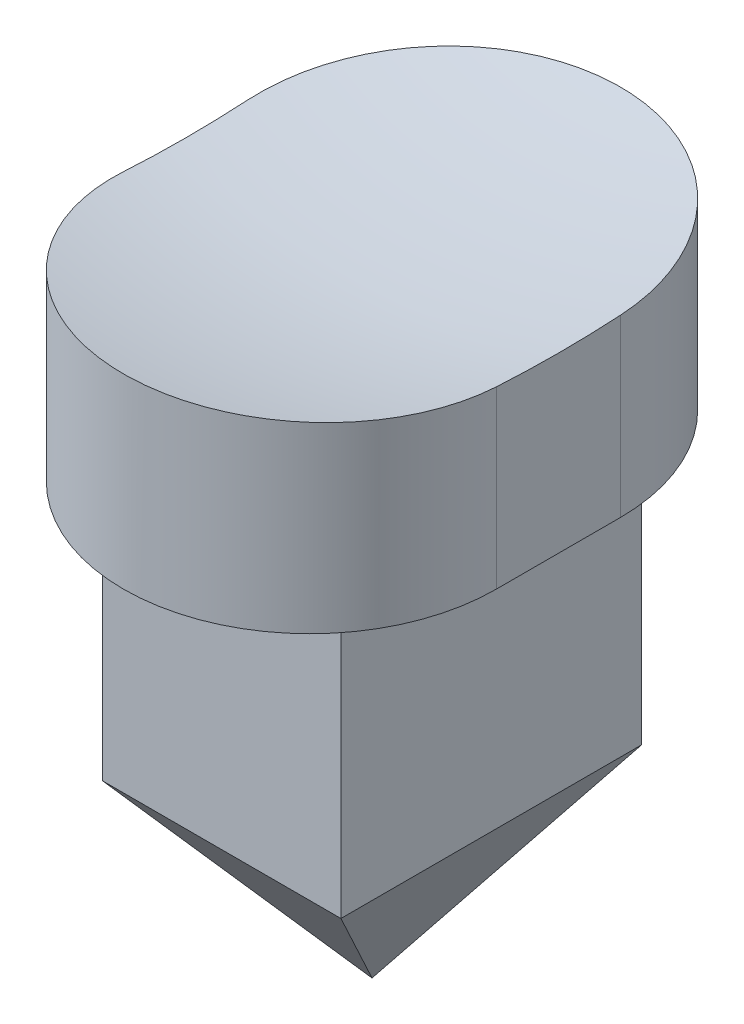
ISO-10303-21;
HEADER;
FILE_DESCRIPTION(('STEP AP214'),'2;1');
FILE_NAME('part.step','',(''),(''),'','','');
FILE_SCHEMA(('AUTOMOTIVE_DESIGN { 1 0 10303 214 1 1 1 1 }'));
ENDSEC;
DATA;
#1=APPLICATION_CONTEXT('core data for automotive mechanical design processes');
#2=APPLICATION_PROTOCOL_DEFINITION('international standard','automotive_design',2000,#1);
#3=PRODUCT_CONTEXT('',#1,'mechanical');
#4=PRODUCT('Part','Part','',(#3));
#5=PRODUCT_RELATED_PRODUCT_CATEGORY('part','',(#4));
#6=PRODUCT_DEFINITION_FORMATION('','',#4);
#7=PRODUCT_DEFINITION_CONTEXT('part definition',#1,'design');
#8=PRODUCT_DEFINITION('design','',#6,#7);
#9=PRODUCT_DEFINITION_SHAPE('','',#8);
#10=(LENGTH_UNIT() NAMED_UNIT(*) SI_UNIT(.MILLI.,.METRE.));
#11=(NAMED_UNIT(*) PLANE_ANGLE_UNIT() SI_UNIT($,.RADIAN.));
#12=(NAMED_UNIT(*) SI_UNIT($,.STERADIAN.) SOLID_ANGLE_UNIT());
#13=UNCERTAINTY_MEASURE_WITH_UNIT(LENGTH_MEASURE(1.E-05),#10,'distance_accuracy_value','');
#14=(GEOMETRIC_REPRESENTATION_CONTEXT(3) GLOBAL_UNCERTAINTY_ASSIGNED_CONTEXT((#13)) GLOBAL_UNIT_ASSIGNED_CONTEXT((#10,
#11,#12)) REPRESENTATION_CONTEXT('',''));
#15=CARTESIAN_POINT('',(0.,0.,0.));
#16=DIRECTION('',(0.,0.,1.));
#17=DIRECTION('',(1.,0.,0.));
#18=AXIS2_PLACEMENT_3D('',#15,#16,#17);
#19=CARTESIAN_POINT('',(0.,22.1,-5.));
#20=DIRECTION('',(0.,1.,0.));
#21=DIRECTION('',(0.,0.,1.));
#22=AXIS2_PLACEMENT_3D('',#19,#20,#21);
#23=PLANE('',#22);
#24=DIRECTION('',(1.,0.,0.));
#25=VECTOR('',#24,1.);
#26=CARTESIAN_POINT('',(0.,22.1,13.15));
#27=LINE('',#26,#25);
#28=CARTESIAN_POINT('',(-10.65,22.1,13.15));
#29=VERTEX_POINT('',#28);
#30=CARTESIAN_POINT('',(10.65,22.1,13.15));
#31=VERTEX_POINT('',#30);
#32=EDGE_CURVE('E286',#29,#31,#27,.T.);
#33=ORIENTED_EDGE('',*,*,#32,.T.);
#34=DIRECTION('',(0.,0.,-1.));
#35=VECTOR('',#34,1.);
#36=CARTESIAN_POINT('',(10.65,22.1,-5.));
#37=LINE('',#36,#35);
#38=CARTESIAN_POINT('',(10.65,22.1,-13.15));
#39=VERTEX_POINT('',#38);
#40=EDGE_CURVE('E315',#31,#39,#37,.T.);
#41=ORIENTED_EDGE('',*,*,#40,.T.);
#42=DIRECTION('',(-1.,0.,0.));
#43=VECTOR('',#42,1.);
#44=CARTESIAN_POINT('',(0.,22.1,-13.15));
#45=LINE('',#44,#43);
#46=CARTESIAN_POINT('',(-10.65,22.1,-13.15));
#47=VERTEX_POINT('',#46);
#48=EDGE_CURVE('E313',#39,#47,#45,.T.);
#49=ORIENTED_EDGE('',*,*,#48,.T.);
#50=DIRECTION('',(0.,0.,1.));
#51=VECTOR('',#50,1.);
#52=CARTESIAN_POINT('',(-10.65,22.1,-5.));
#53=LINE('',#52,#51);
#54=EDGE_CURVE('E311',#47,#29,#53,.T.);
#55=ORIENTED_EDGE('',*,*,#54,.T.);
#56=EDGE_LOOP('',(#33,#41,#49,#55));
#57=FACE_BOUND('',#56,.T.);
#58=CARTESIAN_POINT('',(0.,22.1,-5.));
#59=DIRECTION('',(0.,1.,0.));
#60=DIRECTION('',(0.,0.,1.));
#61=AXIS2_PLACEMENT_3D('',#58,#59,#60);
#62=CIRCLE('',#61,15.);
#63=CARTESIAN_POINT('',(15.,22.1,-4.99999999999999));
#64=VERTEX_POINT('',#63);
#65=CARTESIAN_POINT('',(-15.,22.1,-4.99999999999999));
#66=VERTEX_POINT('',#65);
#67=EDGE_CURVE('E204',#64,#66,#62,.T.);
#68=ORIENTED_EDGE('',*,*,#67,.F.);
#69=DIRECTION('',(0.,0.,-1.));
#70=VECTOR('',#69,1.);
#71=CARTESIAN_POINT('',(15.,22.1,-4.99999999999999));
#72=LINE('',#71,#70);
#73=CARTESIAN_POINT('',(15.,22.1,4.99999999999999));
#74=VERTEX_POINT('',#73);
#75=EDGE_CURVE('E170',#74,#64,#72,.T.);
#76=ORIENTED_EDGE('',*,*,#75,.F.);
#77=CARTESIAN_POINT('',(0.,22.1,5.));
#78=DIRECTION('',(0.,1.,0.));
#79=DIRECTION('',(0.,0.,1.));
#80=AXIS2_PLACEMENT_3D('',#77,#78,#79);
#81=CIRCLE('',#80,15.);
#82=CARTESIAN_POINT('',(-15.,22.1,4.99999999999998));
#83=VERTEX_POINT('',#82);
#84=EDGE_CURVE('E197',#83,#74,#81,.T.);
#85=ORIENTED_EDGE('',*,*,#84,.F.);
#86=DIRECTION('',(0.,0.,1.));
#87=VECTOR('',#86,1.);
#88=CARTESIAN_POINT('',(-15.,22.1,-4.99999999999999));
#89=LINE('',#88,#87);
#90=EDGE_CURVE('E193',#66,#83,#89,.T.);
#91=ORIENTED_EDGE('',*,*,#90,.F.);
#92=EDGE_LOOP('',(#68,#76,#85,#91));
#93=FACE_BOUND('',#92,.T.);
#94=ADVANCED_FACE('F80',(#57,#93),#23,.F.);
#95=CARTESIAN_POINT('',(0.,37.1,-5.));
#96=DIRECTION('',(0.,-1.,0.));
#97=DIRECTION('',(0.,0.,-1.));
#98=AXIS2_PLACEMENT_3D('',#95,#96,#97);
#99=CYLINDRICAL_SURFACE('',#98,15.);
#100=DIRECTION('',(0.,-1.,0.));
#101=VECTOR('',#100,1.);
#102=CARTESIAN_POINT('',(-15.,37.1,-4.99999999999999));
#103=LINE('',#102,#101);
#104=CARTESIAN_POINT('',(-15.,36.2001789978045,-4.99999999999999));
#105=VERTEX_POINT('',#104);
#106=EDGE_CURVE('E191',#105,#66,#103,.T.);
#107=ORIENTED_EDGE('',*,*,#106,.F.);
#108=CARTESIAN_POINT('',(-14.9999999986667,36.2001670646057,-4.99979999999999));
#109=CARTESIAN_POINT('',(-15.0000505971134,36.225372023753,-5.4222362160583));
#110=CARTESIAN_POINT('',(-14.9821679105655,36.2505881800374,-5.84466570095554));
#111=CARTESIAN_POINT('',(-14.9108609043045,36.300862785471,-6.68650562986717));
#112=CARTESIAN_POINT('',(-14.8574381659499,36.3259212415869,-7.10591620736893));
#113=CARTESIAN_POINT('',(-14.7154223005256,36.375686374263,-7.93847907650016));
#114=CARTESIAN_POINT('',(-14.6268521512979,36.4003932697485,-8.35163527413465));
#115=CARTESIAN_POINT('',(-14.4151793673019,36.4492950471374,-9.1690299406811));
#116=CARTESIAN_POINT('',(-14.292077173893,36.4734899355806,-9.57326852349926));
#117=CARTESIAN_POINT('',(-14.0121336587021,36.5212061012485,-10.3701538849595));
#118=CARTESIAN_POINT('',(-13.8552758604046,36.5447270431359,-10.7627948958668));
#119=CARTESIAN_POINT('',(-13.5089637359969,36.590913401162,-11.5334806097786));
#120=CARTESIAN_POINT('',(-13.3195094386151,36.6135788180546,-11.911525325647));
#121=CARTESIAN_POINT('',(-12.9093836228457,36.6578855797966,-12.650245472503));
#122=CARTESIAN_POINT('',(-12.6887185384304,36.679527134487,-13.0109244628722));
#123=CARTESIAN_POINT('',(-12.217702380577,36.7216339066189,-13.7124184148315));
#124=CARTESIAN_POINT('',(-11.9673514637172,36.7420991302643,-14.05323348118));
#125=CARTESIAN_POINT('',(-11.4389338729753,36.7816892599247,-14.712314921096));
#126=CARTESIAN_POINT('',(-11.1608881896398,36.8008151625988,-15.0305980638216));
#127=CARTESIAN_POINT('',(-10.5788921592146,36.8376038273064,-15.6426201274413));
#128=CARTESIAN_POINT('',(-10.2749417745466,36.8552665872172,-15.9363590127294));
#129=CARTESIAN_POINT('',(-9.64324599968441,36.88900186209,-16.4972273210325));
#130=CARTESIAN_POINT('',(-9.31549710200202,36.9050741418145,-16.764352807876));
#131=CARTESIAN_POINT('',(-8.6385739128506,36.9355071163803,-17.2700253616051));
#132=CARTESIAN_POINT('',(-8.28939965765111,36.9498678141188,-17.508572476867));
#133=CARTESIAN_POINT('',(-7.57273722717455,36.9767480824665,-17.9549821451278));
#134=CARTESIAN_POINT('',(-7.20528201927106,36.9892708171931,-18.1628974342883));
#135=CARTESIAN_POINT('',(-6.45410999467888,37.01241245355,-18.5470447185739));
#136=CARTESIAN_POINT('',(-6.07039319391636,37.0230313570449,-18.7232767447279));
#137=CARTESIAN_POINT('',(-5.28945725430007,37.0422859979748,-19.0427780307539));
#138=CARTESIAN_POINT('',(-4.89223908545358,37.050921877536,-19.1860496529486));
#139=CARTESIAN_POINT('',(-4.08710512381802,37.0661473428441,-19.4386141454512));
#140=CARTESIAN_POINT('',(-3.67918934188229,37.0727369306668,-19.5479070502309));
#141=CARTESIAN_POINT('',(-2.85622623604338,37.0838119920331,-19.7315796883256));
#142=CARTESIAN_POINT('',(-2.44119129872767,37.0883007984586,-19.8060147236421));
#143=CARTESIAN_POINT('',(-1.60631240182303,37.0951564780238,-19.9196932375491));
#144=CARTESIAN_POINT('',(-1.18646844743868,37.0975233534596,-19.9589367542221));
#145=CARTESIAN_POINT('',(-0.344953273708517,37.1001176139483,-20.001950207149));
#146=CARTESIAN_POINT('',(0.0767179779047312,37.100344961065,-20.0057195144048));
#147=CARTESIAN_POINT('',(0.918877310137343,37.0986583762127,-19.9777557681976));
#148=CARTESIAN_POINT('',(1.33936539105418,37.096744444782,-19.9460227236614));
#149=CARTESIAN_POINT('',(2.17582436034105,37.0907919455528,-19.8473228610139));
#150=CARTESIAN_POINT('',(2.5917986360909,37.0867551023708,-19.7803846429692));
#151=CARTESIAN_POINT('',(3.41662021867459,37.076587741602,-19.6117725229433));
#152=CARTESIAN_POINT('',(3.82546753065938,37.0704572255285,-19.5100986460679));
#153=CARTESIAN_POINT('',(4.63313065257542,37.0561479300767,-19.272745493707));
#154=CARTESIAN_POINT('',(5.03194649796884,37.0479691579404,-19.1370663384519));
#155=CARTESIAN_POINT('',(5.81671915611364,37.0296237807565,-18.8326754109088));
#156=CARTESIAN_POINT('',(6.20267596252054,37.0194571747281,-18.6639636223232));
#157=CARTESIAN_POINT('',(6.95914649743477,36.997206664887,-18.2946422311087));
#158=CARTESIAN_POINT('',(7.32965401650439,36.9851219993631,-18.0940199559307));
#159=CARTESIAN_POINT('',(8.05243956871306,36.9591272223988,-17.662361718047));
#160=CARTESIAN_POINT('',(8.40471759436956,36.945217110209,-17.4313257428578));
#161=CARTESIAN_POINT('',(9.08853860660945,36.9156741731514,-16.9405019991736));
#162=CARTESIAN_POINT('',(9.42008251368116,36.9000414248449,-16.6807155084741));
#163=CARTESIAN_POINT('',(10.0601125324881,36.8671670603081,-16.1342357508033));
#164=CARTESIAN_POINT('',(10.3685986625505,36.8499254453565,-15.847542505219));
#165=CARTESIAN_POINT('',(10.9607072661255,36.8139366891092,-15.2489194936914));
#166=CARTESIAN_POINT('',(11.2442984914738,36.7951877107306,-14.9369589299258));
#167=CARTESIAN_POINT('',(11.7841914602273,36.756339134032,-14.2903302847405));
#168=CARTESIAN_POINT('',(12.0404929784728,36.7362395245706,-13.9556620160034));
#169=CARTESIAN_POINT('',(12.5240821456442,36.6948285623558,-13.2658840525618));
#170=CARTESIAN_POINT('',(12.7513600065915,36.6735168042996,-12.9107675201289));
#171=CARTESIAN_POINT('',(13.1751970272208,36.6298423552078,-12.1827291049954));
#172=CARTESIAN_POINT('',(13.3717570847364,36.6074796949133,-11.8098077431183));
#173=CARTESIAN_POINT('',(13.7332179907482,36.5618094183407,-11.0478875081639));
#174=CARTESIAN_POINT('',(13.8980422253582,36.5384996758395,-10.6588524164859));
#175=CARTESIAN_POINT('',(14.1942860222416,36.4911532445589,-9.86830739179908));
#176=CARTESIAN_POINT('',(14.3257057335659,36.4671165590235,-9.46679751446172));
#177=CARTESIAN_POINT('',(14.5540704193931,36.4185205439717,-8.65468816199068));
#178=CARTESIAN_POINT('',(14.6510591891351,36.3939619208176,-8.24410094467479));
#179=CARTESIAN_POINT('',(14.8100796881022,36.3444766353984,-7.41640222588438));
#180=CARTESIAN_POINT('',(14.8721285052236,36.3195501591691,-6.99929401636119));
#181=CARTESIAN_POINT('',(14.9443461299928,36.2788364920903,-6.31770273442135));
#182=CARTESIAN_POINT('',(14.965232792922,36.2631073330853,-6.05430539317481));
#183=CARTESIAN_POINT('',(14.9930514530183,36.2316402058825,-5.52721450506767));
#184=CARTESIAN_POINT('',(15.0000065075313,36.2159022954325,-5.26352217152712));
#185=CARTESIAN_POINT('',(14.9999999986667,36.2001670646057,-4.99979999999999));
#186=B_SPLINE_CURVE_WITH_KNOTS('',3,(#108,#109,#110,#111,#112,#113,#114,#115,#116,#117,#118,
#119,#120,#121,#122,#123,#124,#125,#126,#127,#128,#129,#130,#131,#132,#133,#134,#135,#136,#137,
#138,#139,#140,#141,#142,#143,#144,#145,#146,#147,#148,#149,#150,#151,#152,#153,#154,#155,#156,
#157,#158,#159,#160,#161,#162,#163,#164,#165,#166,#167,#168,#169,#170,#171,#172,#173,#174,#175,
#176,#177,#178,#179,#180,#181,#182,#183,#184,#185),.UNSPECIFIED.,.F.,.F.,(4,2,2,2,2,2,2,2,2,2,2,
2,2,2,2,2,2,2,2,2,2,2,2,2,2,2,2,2,2,2,2,2,2,2,2,2,2,2,4),(0.,1.26917572026778,2.53829497219462,
3.80658589265856,5.07486060363743,6.34375578456622,7.61264984717396,8.88128271282821,
10.149908887357,11.4175807514039,12.6852544544128,13.9531153712605,15.2209741418907,
16.486623982296,17.7522725831864,19.0178304448206,20.2833870225228,21.5469289355155,
22.8104694811646,24.0740324307842,25.3375950626915,26.6001327804068,27.862669585599,
29.125201926978,30.387734891265,31.6507705004315,32.9138066280253,34.1767866434419,
35.439765654983,36.7043079466293,37.9688606708409,39.2338387346364,40.498779818175,
41.7667373436089,43.0346892113164,44.3010224500856,45.5667358309269,46.3604734084631,
47.152896230875),.UNSPECIFIED.);
#187=CARTESIAN_POINT('',(15.,36.2001789978045,-4.99999999999999));
#188=VERTEX_POINT('',#187);
#189=EDGE_CURVE('E186',#105,#188,#186,.T.);
#190=ORIENTED_EDGE('',*,*,#189,.T.);
#191=DIRECTION('',(0.,-1.,0.));
#192=VECTOR('',#191,1.);
#193=CARTESIAN_POINT('',(15.,37.1,-4.99999999999999));
#194=LINE('',#193,#192);
#195=EDGE_CURVE('E202',#188,#64,#194,.T.);
#196=ORIENTED_EDGE('',*,*,#195,.T.);
#197=ORIENTED_EDGE('',*,*,#67,.T.);
#198=EDGE_LOOP('',(#107,#190,#196,#197));
#199=FACE_BOUND('',#198,.T.);
#200=ADVANCED_FACE('F228',(#199),#99,.T.);
#201=CARTESIAN_POINT('',(-15.,37.1,-4.99999999999999));
#202=DIRECTION('',(1.,0.,0.));
#203=DIRECTION('',(0.,0.,-1.));
#204=AXIS2_PLACEMENT_3D('',#201,#202,#203);
#205=PLANE('',#204);
#206=DIRECTION('',(0.,-1.,0.));
#207=VECTOR('',#206,1.);
#208=CARTESIAN_POINT('',(-15.,37.1,4.99999999999998));
#209=LINE('',#208,#207);
#210=CARTESIAN_POINT('',(-15.,36.2001789978045,4.99999999999998));
#211=VERTEX_POINT('',#210);
#212=EDGE_CURVE('E195',#211,#83,#209,.T.);
#213=ORIENTED_EDGE('',*,*,#212,.F.);
#214=CARTESIAN_POINT('',(-15.,120.,0.));
#215=DIRECTION('',(1.,0.,0.));
#216=DIRECTION('',(0.,0.,-1.));
#217=AXIS2_PLACEMENT_3D('',#214,#215,#216);
#218=CIRCLE('',#217,83.9488534763876);
#219=EDGE_CURVE('E194',#211,#105,#218,.T.);
#220=ORIENTED_EDGE('',*,*,#219,.T.);
#221=ORIENTED_EDGE('',*,*,#106,.T.);
#222=ORIENTED_EDGE('',*,*,#90,.T.);
#223=EDGE_LOOP('',(#213,#220,#221,#222));
#224=FACE_BOUND('',#223,.T.);
#225=ADVANCED_FACE('F281',(#224),#205,.F.);
#226=CARTESIAN_POINT('',(0.,37.1,5.));
#227=DIRECTION('',(0.,-1.,0.));
#228=DIRECTION('',(0.,0.,-1.));
#229=AXIS2_PLACEMENT_3D('',#226,#227,#228);
#230=CYLINDRICAL_SURFACE('',#229,15.);
#231=DIRECTION('',(0.,-1.,0.));
#232=VECTOR('',#231,1.);
#233=CARTESIAN_POINT('',(15.,37.1,4.99999999999999));
#234=LINE('',#233,#232);
#235=CARTESIAN_POINT('',(15.,36.2001789978045,4.99999999999999));
#236=VERTEX_POINT('',#235);
#237=EDGE_CURVE('E199',#236,#74,#234,.T.);
#238=ORIENTED_EDGE('',*,*,#237,.F.);
#239=CARTESIAN_POINT('',(14.9999999986667,36.2001670646057,4.99979999999998));
#240=CARTESIAN_POINT('',(15.0000505971134,36.225372023753,5.4222362160583));
#241=CARTESIAN_POINT('',(14.9821679105655,36.2505881800374,5.84466570095554));
#242=CARTESIAN_POINT('',(14.9108609043045,36.300862785471,6.68650562986717));
#243=CARTESIAN_POINT('',(14.8574381659499,36.3259212415869,7.10591620736892));
#244=CARTESIAN_POINT('',(14.7154223005256,36.375686374263,7.93847907650015));
#245=CARTESIAN_POINT('',(14.6268521512979,36.4003932697485,8.35163527413464));
#246=CARTESIAN_POINT('',(14.4151793673019,36.4492950471374,9.16902994068109));
#247=CARTESIAN_POINT('',(14.292077173893,36.4734899355806,9.57326852349926));
#248=CARTESIAN_POINT('',(14.0121336587021,36.5212061012485,10.3701538849595));
#249=CARTESIAN_POINT('',(13.8552758604046,36.5447270431359,10.7627948958668));
#250=CARTESIAN_POINT('',(13.5089637359969,36.590913401162,11.5334806097786));
#251=CARTESIAN_POINT('',(13.3195094386151,36.6135788180546,11.911525325647));
#252=CARTESIAN_POINT('',(12.9093836228457,36.6578855797966,12.650245472503));
#253=CARTESIAN_POINT('',(12.6887185384304,36.679527134487,13.0109244628722));
#254=CARTESIAN_POINT('',(12.217702380577,36.7216339066189,13.7124184148314));
#255=CARTESIAN_POINT('',(11.9673514637172,36.7420991302643,14.05323348118));
#256=CARTESIAN_POINT('',(11.4389338729753,36.7816892599247,14.712314921096));
#257=CARTESIAN_POINT('',(11.1608881896398,36.8008151625989,15.0305980638216));
#258=CARTESIAN_POINT('',(10.5788921592146,36.8376038273064,15.6426201274413));
#259=CARTESIAN_POINT('',(10.2749417745466,36.8552665872172,15.9363590127294));
#260=CARTESIAN_POINT('',(9.64324599968442,36.88900186209,16.4972273210324));
#261=CARTESIAN_POINT('',(9.31549710200203,36.9050741418145,16.764352807876));
#262=CARTESIAN_POINT('',(8.6385739128506,36.9355071163802,17.2700253616051));
#263=CARTESIAN_POINT('',(8.28939965765112,36.9498678141188,17.508572476867));
#264=CARTESIAN_POINT('',(7.57273722717456,36.9767480824665,17.9549821451278));
#265=CARTESIAN_POINT('',(7.20528201927107,36.9892708171931,18.1628974342883));
#266=CARTESIAN_POINT('',(6.45410999467889,37.01241245355,18.5470447185739));
#267=CARTESIAN_POINT('',(6.07039319391637,37.0230313570449,18.7232767447279));
#268=CARTESIAN_POINT('',(5.28945725430008,37.0422859979747,19.0427780307539));
#269=CARTESIAN_POINT('',(4.89223908545359,37.050921877536,19.1860496529486));
#270=CARTESIAN_POINT('',(4.08710512381802,37.0661473428441,19.4386141454512));
#271=CARTESIAN_POINT('',(3.6791893418823,37.0727369306668,19.5479070502309));
#272=CARTESIAN_POINT('',(2.85622623604339,37.0838119920331,19.7315796883256));
#273=CARTESIAN_POINT('',(2.44119129872767,37.0883007984586,19.8060147236421));
#274=CARTESIAN_POINT('',(1.60631240182304,37.0951564780238,19.9196932375491));
#275=CARTESIAN_POINT('',(1.18646844743869,37.0975233534596,19.9589367542221));
#276=CARTESIAN_POINT('',(0.344953273708525,37.1001176139483,20.001950207149));
#277=CARTESIAN_POINT('',(-0.0767179779047238,37.100344961065,20.0057195144048));
#278=CARTESIAN_POINT('',(-0.918877310137338,37.0986583762127,19.9777557681976));
#279=CARTESIAN_POINT('',(-1.33936539105417,37.096744444782,19.9460227236614));
#280=CARTESIAN_POINT('',(-2.17582436034105,37.0907919455528,19.8473228610139));
#281=CARTESIAN_POINT('',(-2.59179863609089,37.0867551023708,19.7803846429692));
#282=CARTESIAN_POINT('',(-3.41662021867459,37.076587741602,19.6117725229433));
#283=CARTESIAN_POINT('',(-3.82546753065938,37.0704572255285,19.5100986460679));
#284=CARTESIAN_POINT('',(-4.63313065257541,37.0561479300767,19.272745493707));
#285=CARTESIAN_POINT('',(-5.03194649796883,37.0479691579404,19.1370663384519));
#286=CARTESIAN_POINT('',(-5.81671915611363,37.0296237807565,18.8326754109088));
#287=CARTESIAN_POINT('',(-6.20267596252054,37.0194571747281,18.6639636223232));
#288=CARTESIAN_POINT('',(-6.95914649743477,36.997206664887,18.2946422311087));
#289=CARTESIAN_POINT('',(-7.32965401650439,36.9851219993631,18.0940199559307));
#290=CARTESIAN_POINT('',(-8.05243956871306,36.9591272223988,17.662361718047));
#291=CARTESIAN_POINT('',(-8.40471759436956,36.945217110209,17.4313257428578));
#292=CARTESIAN_POINT('',(-9.08853860660945,36.9156741731514,16.9405019991737));
#293=CARTESIAN_POINT('',(-9.42008251368116,36.9000414248449,16.6807155084741));
#294=CARTESIAN_POINT('',(-10.0601125324881,36.8671670603081,16.1342357508033));
#295=CARTESIAN_POINT('',(-10.3685986625505,36.8499254453565,15.847542505219));
#296=CARTESIAN_POINT('',(-10.9607072661255,36.8139366891092,15.2489194936914));
#297=CARTESIAN_POINT('',(-11.2442984914738,36.7951877107306,14.9369589299258));
#298=CARTESIAN_POINT('',(-11.7841914602273,36.756339134032,14.2903302847405));
#299=CARTESIAN_POINT('',(-12.0404929784728,36.7362395245706,13.9556620160034));
#300=CARTESIAN_POINT('',(-12.5240821456442,36.6948285623558,13.2658840525619));
#301=CARTESIAN_POINT('',(-12.7513600065915,36.6735168042995,12.9107675201289));
#302=CARTESIAN_POINT('',(-13.1751970272208,36.6298423552078,12.1827291049954));
#303=CARTESIAN_POINT('',(-13.3717570847364,36.6074796949134,11.8098077431183));
#304=CARTESIAN_POINT('',(-13.7332179907482,36.5618094183407,11.0478875081639));
#305=CARTESIAN_POINT('',(-13.8980422253582,36.5384996758396,10.6588524164859));
#306=CARTESIAN_POINT('',(-14.1942860222416,36.4911532445589,9.86830739179909));
#307=CARTESIAN_POINT('',(-14.3257057335659,36.4671165590235,9.46679751446173));
#308=CARTESIAN_POINT('',(-14.5540704193931,36.4185205439717,8.6546881619907));
#309=CARTESIAN_POINT('',(-14.6510591891351,36.3939619208176,8.2441009446748));
#310=CARTESIAN_POINT('',(-14.8100796881022,36.3444766353984,7.41640222588439));
#311=CARTESIAN_POINT('',(-14.8721285052236,36.3195501591691,6.9992940163612));
#312=CARTESIAN_POINT('',(-14.9443461299928,36.2788364920903,6.31770273442136));
#313=CARTESIAN_POINT('',(-14.965232792922,36.2631073330853,6.05430539317482));
#314=CARTESIAN_POINT('',(-14.9930514530183,36.2316402058825,5.52721450506767));
#315=CARTESIAN_POINT('',(-15.0000065075313,36.2159022954325,5.26352217152712));
#316=CARTESIAN_POINT('',(-14.9999999986667,36.2001670646057,4.99979999999998));
#317=B_SPLINE_CURVE_WITH_KNOTS('',3,(#239,#240,#241,#242,#243,#244,#245,#246,#247,#248,#249,
#250,#251,#252,#253,#254,#255,#256,#257,#258,#259,#260,#261,#262,#263,#264,#265,#266,#267,#268,
#269,#270,#271,#272,#273,#274,#275,#276,#277,#278,#279,#280,#281,#282,#283,#284,#285,#286,#287,
#288,#289,#290,#291,#292,#293,#294,#295,#296,#297,#298,#299,#300,#301,#302,#303,#304,#305,#306,
#307,#308,#309,#310,#311,#312,#313,#314,#315,#316),.UNSPECIFIED.,.F.,.F.,(4,2,2,2,2,2,2,2,2,2,2,
2,2,2,2,2,2,2,2,2,2,2,2,2,2,2,2,2,2,2,2,2,2,2,2,2,2,2,4),(0.,1.26917572026778,2.53829497219462,
3.80658589265856,5.07486060363742,6.34375578456621,7.61264984717395,8.8812827128282,
10.149908887357,11.4175807514039,12.6852544544128,13.9531153712605,15.2209741418907,
16.486623982296,17.7522725831863,19.0178304448206,20.2833870225228,21.5469289355155,
22.8104694811646,24.0740324307842,25.3375950626915,26.6001327804068,27.862669585599,
29.125201926978,30.387734891265,31.6507705004315,32.9138066280253,34.1767866434419,
35.439765654983,36.7043079466294,37.9688606708409,39.2338387346364,40.498779818175,
41.7667373436089,43.0346892113164,44.3010224500856,45.5667358309269,46.3604734084631,
47.152896230875),.UNSPECIFIED.);
#318=EDGE_CURVE('E198',#236,#211,#317,.T.);
#319=ORIENTED_EDGE('',*,*,#318,.T.);
#320=ORIENTED_EDGE('',*,*,#212,.T.);
#321=ORIENTED_EDGE('',*,*,#84,.T.);
#322=EDGE_LOOP('',(#238,#319,#320,#321));
#323=FACE_BOUND('',#322,.T.);
#324=ADVANCED_FACE('F300',(#323),#230,.T.);
#325=CARTESIAN_POINT('',(15.,37.1,-4.99999999999999));
#326=DIRECTION('',(-1.,0.,0.));
#327=DIRECTION('',(0.,0.,1.));
#328=AXIS2_PLACEMENT_3D('',#325,#326,#327);
#329=PLANE('',#328);
#330=ORIENTED_EDGE('',*,*,#195,.F.);
#331=CARTESIAN_POINT('',(15.,120.,0.));
#332=DIRECTION('',(-1.,0.,0.));
#333=DIRECTION('',(0.,0.,1.));
#334=AXIS2_PLACEMENT_3D('',#331,#332,#333);
#335=CIRCLE('',#334,83.9488534763876);
#336=EDGE_CURVE('E201',#188,#236,#335,.T.);
#337=ORIENTED_EDGE('',*,*,#336,.T.);
#338=ORIENTED_EDGE('',*,*,#237,.T.);
#339=ORIENTED_EDGE('',*,*,#75,.T.);
#340=EDGE_LOOP('',(#330,#337,#338,#339));
#341=FACE_BOUND('',#340,.T.);
#342=ADVANCED_FACE('F236',(#341),#329,.F.);
#343=CARTESIAN_POINT('',(0.,120.,0.));
#344=DIRECTION('',(0.,0.,1.));
#345=DIRECTION('',(0.,1.,0.));
#346=AXIS2_PLACEMENT_3D('',#343,#344,#345);
#347=SPHERICAL_SURFACE('',#346,85.278426345706);
#348=ORIENTED_EDGE('',*,*,#318,.F.);
#349=ORIENTED_EDGE('',*,*,#336,.F.);
#350=ORIENTED_EDGE('',*,*,#189,.F.);
#351=ORIENTED_EDGE('',*,*,#219,.F.);
#352=EDGE_LOOP('',(#348,#349,#350,#351));
#353=FACE_BOUND('',#352,.T.);
#354=ADVANCED_FACE('F231',(#353),#347,.F.);
#355=CARTESIAN_POINT('',(9.9,32.1,0.));
#356=DIRECTION('',(1.,0.,0.));
#357=DIRECTION('',(0.,0.,-1.));
#358=AXIS2_PLACEMENT_3D('',#355,#356,#357);
#359=PLANE('',#358);
#360=DIRECTION('',(0.,-1.,0.));
#361=VECTOR('',#360,1.);
#362=CARTESIAN_POINT('',(9.9,32.1,-12.4));
#363=LINE('',#362,#361);
#364=CARTESIAN_POINT('',(9.9,32.4,-12.4));
#365=VERTEX_POINT('',#364);
#366=CARTESIAN_POINT('',(9.9,22.85,-12.4));
#367=VERTEX_POINT('',#366);
#368=EDGE_CURVE('E158',#365,#367,#363,.T.);
#369=ORIENTED_EDGE('',*,*,#368,.T.);
#370=DIRECTION('',(0.,0.,1.));
#371=VECTOR('',#370,1.);
#372=CARTESIAN_POINT('',(9.9,22.85,0.));
#373=LINE('',#372,#371);
#374=CARTESIAN_POINT('',(9.9,22.85,12.4));
#375=VERTEX_POINT('',#374);
#376=EDGE_CURVE('E179',#367,#375,#373,.T.);
#377=ORIENTED_EDGE('',*,*,#376,.T.);
#378=DIRECTION('',(0.,-1.,0.));
#379=VECTOR('',#378,1.);
#380=CARTESIAN_POINT('',(9.9,32.1,12.4));
#381=LINE('',#380,#379);
#382=CARTESIAN_POINT('',(9.9,32.4,12.4));
#383=VERTEX_POINT('',#382);
#384=EDGE_CURVE('E183',#383,#375,#381,.T.);
#385=ORIENTED_EDGE('',*,*,#384,.F.);
#386=DIRECTION('',(0.,0.,1.));
#387=VECTOR('',#386,1.);
#388=CARTESIAN_POINT('',(9.9,32.4,12.4));
#389=LINE('',#388,#387);
#390=EDGE_CURVE('E176',#365,#383,#389,.T.);
#391=ORIENTED_EDGE('',*,*,#390,.F.);
#392=EDGE_LOOP('',(#369,#377,#385,#391));
#393=FACE_BOUND('',#392,.T.);
#394=ADVANCED_FACE('F182',(#393),#359,.F.);
#395=CARTESIAN_POINT('',(0.,32.1,-12.4));
#396=DIRECTION('',(0.,0.,-1.));
#397=DIRECTION('',(-1.,0.,0.));
#398=AXIS2_PLACEMENT_3D('',#395,#396,#397);
#399=PLANE('',#398);
#400=DIRECTION('',(0.,-1.,0.));
#401=VECTOR('',#400,1.);
#402=CARTESIAN_POINT('',(-9.9,32.1,-12.4));
#403=LINE('',#402,#401);
#404=CARTESIAN_POINT('',(-9.9,32.4,-12.4));
#405=VERTEX_POINT('',#404);
#406=CARTESIAN_POINT('',(-9.9,22.85,-12.4));
#407=VERTEX_POINT('',#406);
#408=EDGE_CURVE('E169',#405,#407,#403,.T.);
#409=ORIENTED_EDGE('',*,*,#408,.T.);
#410=DIRECTION('',(1.,0.,0.));
#411=VECTOR('',#410,1.);
#412=CARTESIAN_POINT('',(0.,22.85,-12.4));
#413=LINE('',#412,#411);
#414=EDGE_CURVE('E164',#407,#367,#413,.T.);
#415=ORIENTED_EDGE('',*,*,#414,.T.);
#416=ORIENTED_EDGE('',*,*,#368,.F.);
#417=DIRECTION('',(-1.,0.,0.));
#418=VECTOR('',#417,1.);
#419=CARTESIAN_POINT('',(34.4018144497535,32.4,-12.4));
#420=LINE('',#419,#418);
#421=EDGE_CURVE('E161',#365,#405,#420,.T.);
#422=ORIENTED_EDGE('',*,*,#421,.T.);
#423=EDGE_LOOP('',(#409,#415,#416,#422));
#424=FACE_BOUND('',#423,.T.);
#425=ADVANCED_FACE('F160',(#424),#399,.F.);
#426=CARTESIAN_POINT('',(-9.9,32.1,0.));
#427=DIRECTION('',(-1.,0.,0.));
#428=DIRECTION('',(0.,0.,1.));
#429=AXIS2_PLACEMENT_3D('',#426,#427,#428);
#430=PLANE('',#429);
#431=DIRECTION('',(0.,-1.,0.));
#432=VECTOR('',#431,1.);
#433=CARTESIAN_POINT('',(-9.9,32.1,12.4));
#434=LINE('',#433,#432);
#435=CARTESIAN_POINT('',(-9.9,32.4,12.4));
#436=VERTEX_POINT('',#435);
#437=CARTESIAN_POINT('',(-9.9,22.85,12.4));
#438=VERTEX_POINT('',#437);
#439=EDGE_CURVE('E305',#436,#438,#434,.T.);
#440=ORIENTED_EDGE('',*,*,#439,.T.);
#441=DIRECTION('',(0.,0.,-1.));
#442=VECTOR('',#441,1.);
#443=CARTESIAN_POINT('',(-9.9,22.85,0.));
#444=LINE('',#443,#442);
#445=EDGE_CURVE('E90',#438,#407,#444,.T.);
#446=ORIENTED_EDGE('',*,*,#445,.T.);
#447=ORIENTED_EDGE('',*,*,#408,.F.);
#448=DIRECTION('',(0.,0.,-1.));
#449=VECTOR('',#448,1.);
#450=CARTESIAN_POINT('',(-9.9,32.4,12.4));
#451=LINE('',#450,#449);
#452=EDGE_CURVE('E178',#436,#405,#451,.T.);
#453=ORIENTED_EDGE('',*,*,#452,.F.);
#454=EDGE_LOOP('',(#440,#446,#447,#453));
#455=FACE_BOUND('',#454,.T.);
#456=ADVANCED_FACE('F245',(#455),#430,.F.);
#457=CARTESIAN_POINT('',(0.,32.1,12.4));
#458=DIRECTION('',(0.,0.,1.));
#459=DIRECTION('',(1.,0.,0.));
#460=AXIS2_PLACEMENT_3D('',#457,#458,#459);
#461=PLANE('',#460);
#462=ORIENTED_EDGE('',*,*,#384,.T.);
#463=DIRECTION('',(-1.,0.,0.));
#464=VECTOR('',#463,1.);
#465=CARTESIAN_POINT('',(0.,22.85,12.4));
#466=LINE('',#465,#464);
#467=EDGE_CURVE('E13',#375,#438,#466,.T.);
#468=ORIENTED_EDGE('',*,*,#467,.T.);
#469=ORIENTED_EDGE('',*,*,#439,.F.);
#470=DIRECTION('',(-1.,0.,0.));
#471=VECTOR('',#470,1.);
#472=CARTESIAN_POINT('',(34.4018144497535,32.4,12.4));
#473=LINE('',#472,#471);
#474=EDGE_CURVE('E180',#383,#436,#473,.T.);
#475=ORIENTED_EDGE('',*,*,#474,.F.);
#476=EDGE_LOOP('',(#462,#468,#469,#475));
#477=FACE_BOUND('',#476,.T.);
#478=ADVANCED_FACE('F242',(#477),#461,.F.);
#479=CARTESIAN_POINT('',(34.4018144497535,32.4,-12.4));
#480=DIRECTION('',(0.,1.,0.));
#481=DIRECTION('',(0.,0.,1.));
#482=AXIS2_PLACEMENT_3D('',#479,#480,#481);
#483=PLANE('',#482);
#484=ORIENTED_EDGE('',*,*,#421,.F.);
#485=ORIENTED_EDGE('',*,*,#390,.T.);
#486=ORIENTED_EDGE('',*,*,#474,.T.);
#487=ORIENTED_EDGE('',*,*,#452,.T.);
#488=EDGE_LOOP('',(#484,#485,#486,#487));
#489=FACE_BOUND('',#488,.T.);
#490=ADVANCED_FACE('F174',(#489),#483,.F.);
#491=CARTESIAN_POINT('',(-9.9,22.85,0.));
#492=DIRECTION('',(-0.707106781186545,0.70710678118655,0.));
#493=DIRECTION('',(0.,0.,-1.));
#494=AXIS2_PLACEMENT_3D('',#491,#492,#493);
#495=PLANE('',#494);
#496=DIRECTION('',(0.577350269189627,0.577350269189622,-0.577350269189629));
#497=VECTOR('',#496,1.);
#498=CARTESIAN_POINT('',(-5.76666666666664,26.9833333333333,8.26666666666662));
#499=LINE('',#498,#497);
#500=EDGE_CURVE('E189',#29,#438,#499,.T.);
#501=ORIENTED_EDGE('',*,*,#500,.F.);
#502=ORIENTED_EDGE('',*,*,#54,.F.);
#503=DIRECTION('',(0.577350269189627,0.577350269189622,0.577350269189628));
#504=VECTOR('',#503,1.);
#505=CARTESIAN_POINT('',(-6.59999999999998,26.15,-9.09999999999998));
#506=LINE('',#505,#504);
#507=EDGE_CURVE('E85',#407,#47,#506,.F.);
#508=ORIENTED_EDGE('',*,*,#507,.F.);
#509=ORIENTED_EDGE('',*,*,#445,.F.);
#510=EDGE_LOOP('',(#501,#502,#508,#509));
#511=FACE_BOUND('',#510,.T.);
#512=ADVANCED_FACE('F83',(#511),#495,.F.);
#513=CARTESIAN_POINT('',(0.,22.85,-12.4));
#514=DIRECTION('',(0.,0.707106781186551,-0.707106781186544));
#515=DIRECTION('',(1.,0.,0.));
#516=AXIS2_PLACEMENT_3D('',#513,#514,#515);
#517=PLANE('',#516);
#518=ORIENTED_EDGE('',*,*,#507,.T.);
#519=ORIENTED_EDGE('',*,*,#48,.F.);
#520=DIRECTION('',(-0.577350269189628,0.577350269189622,0.577350269189628));
#521=VECTOR('',#520,1.);
#522=CARTESIAN_POINT('',(5.76666666666664,26.9833333333333,-8.26666666666664));
#523=LINE('',#522,#521);
#524=EDGE_CURVE('E321',#367,#39,#523,.F.);
#525=ORIENTED_EDGE('',*,*,#524,.F.);
#526=ORIENTED_EDGE('',*,*,#414,.F.);
#527=EDGE_LOOP('',(#518,#519,#525,#526));
#528=FACE_BOUND('',#527,.T.);
#529=ADVANCED_FACE('F265',(#528),#517,.F.);
#530=CARTESIAN_POINT('',(0.,22.85,12.4));
#531=DIRECTION('',(0.,0.707106781186552,0.707106781186543));
#532=DIRECTION('',(-1.,0.,0.));
#533=AXIS2_PLACEMENT_3D('',#530,#531,#532);
#534=PLANE('',#533);
#535=ORIENTED_EDGE('',*,*,#500,.T.);
#536=ORIENTED_EDGE('',*,*,#467,.F.);
#537=DIRECTION('',(0.577350269189627,-0.577350269189622,0.577350269189628));
#538=VECTOR('',#537,1.);
#539=CARTESIAN_POINT('',(5.76666666666664,26.9833333333333,8.26666666666663));
#540=LINE('',#539,#538);
#541=EDGE_CURVE('E319',#31,#375,#540,.F.);
#542=ORIENTED_EDGE('',*,*,#541,.F.);
#543=ORIENTED_EDGE('',*,*,#32,.F.);
#544=EDGE_LOOP('',(#535,#536,#542,#543));
#545=FACE_BOUND('',#544,.T.);
#546=ADVANCED_FACE('F259',(#545),#534,.F.);
#547=CARTESIAN_POINT('',(9.9,22.85,0.));
#548=DIRECTION('',(0.707106781186544,0.707106781186551,0.));
#549=DIRECTION('',(0.,0.,1.));
#550=AXIS2_PLACEMENT_3D('',#547,#548,#549);
#551=PLANE('',#550);
#552=ORIENTED_EDGE('',*,*,#524,.T.);
#553=ORIENTED_EDGE('',*,*,#40,.F.);
#554=ORIENTED_EDGE('',*,*,#541,.T.);
#555=ORIENTED_EDGE('',*,*,#376,.F.);
#556=EDGE_LOOP('',(#552,#553,#554,#555));
#557=FACE_BOUND('',#556,.T.);
#558=ADVANCED_FACE('F253',(#557),#551,.F.);
#559=CLOSED_SHELL('',(#94,#200,#225,#324,#342,#354,#394,#425,#456,#478,#490,#512,#529,#546,#558));
#560=MANIFOLD_SOLID_BREP('B2_NOT_SHOWN',#559);
#561=CARTESIAN_POINT('',(-9.6,22.1,-12.1));
#562=DIRECTION('',(1.,0.,0.));
#563=DIRECTION('',(0.,0.,-1.));
#564=AXIS2_PLACEMENT_3D('',#561,#562,#563);
#565=PLANE('',#564);
#566=DIRECTION('',(0.,-1.,0.));
#567=VECTOR('',#566,1.);
#568=CARTESIAN_POINT('',(-9.6,22.1,12.1));
#569=LINE('',#568,#567);
#570=CARTESIAN_POINT('',(-9.6,31.35,12.1));
#571=VERTEX_POINT('',#570);
#572=CARTESIAN_POINT('',(-9.6,0.,12.1));
#573=VERTEX_POINT('',#572);
#574=EDGE_CURVE('E541',#571,#573,#569,.T.);
#575=ORIENTED_EDGE('',*,*,#574,.F.);
#576=DIRECTION('',(0.,0.,-1.));
#577=VECTOR('',#576,1.);
#578=CARTESIAN_POINT('',(-9.6,31.35,-12.1));
#579=LINE('',#578,#577);
#580=CARTESIAN_POINT('',(-9.6,31.35,-12.1));
#581=VERTEX_POINT('',#580);
#582=EDGE_CURVE('E78',#571,#581,#579,.T.);
#583=ORIENTED_EDGE('',*,*,#582,.T.);
#584=DIRECTION('',(0.,-1.,0.));
#585=VECTOR('',#584,1.);
#586=CARTESIAN_POINT('',(-9.6,22.1,-12.1));
#587=LINE('',#586,#585);
#588=CARTESIAN_POINT('',(-9.6,0.,-12.1));
#589=VERTEX_POINT('',#588);
#590=EDGE_CURVE('E544',#581,#589,#587,.T.);
#591=ORIENTED_EDGE('',*,*,#590,.T.);
#592=DIRECTION('',(0.,0.,-1.));
#593=VECTOR('',#592,1.);
#594=CARTESIAN_POINT('',(-9.6,0.,-12.1));
#595=LINE('',#594,#593);
#596=EDGE_CURVE('E520',#589,#573,#595,.F.);
#597=ORIENTED_EDGE('',*,*,#596,.T.);
#598=EDGE_LOOP('',(#575,#583,#591,#597));
#599=FACE_BOUND('',#598,.T.);
#600=ADVANCED_FACE('F443',(#599),#565,.F.);
#601=CARTESIAN_POINT('',(9.6,22.1,-12.1));
#602=DIRECTION('',(-1.,0.,0.));
#603=DIRECTION('',(0.,0.,1.));
#604=AXIS2_PLACEMENT_3D('',#601,#602,#603);
#605=PLANE('',#604);
#606=DIRECTION('',(0.,-1.,0.));
#607=VECTOR('',#606,1.);
#608=CARTESIAN_POINT('',(9.6,22.1,-12.1));
#609=LINE('',#608,#607);
#610=CARTESIAN_POINT('',(9.6,31.35,-12.1));
#611=VERTEX_POINT('',#610);
#612=CARTESIAN_POINT('',(9.6,0.,-12.1));
#613=VERTEX_POINT('',#612);
#614=EDGE_CURVE('E548',#611,#613,#609,.T.);
#615=ORIENTED_EDGE('',*,*,#614,.F.);
#616=DIRECTION('',(0.,0.,1.));
#617=VECTOR('',#616,1.);
#618=CARTESIAN_POINT('',(9.6,31.35,-12.1));
#619=LINE('',#618,#617);
#620=CARTESIAN_POINT('',(9.6,31.35,12.1));
#621=VERTEX_POINT('',#620);
#622=EDGE_CURVE('E469',#611,#621,#619,.T.);
#623=ORIENTED_EDGE('',*,*,#622,.T.);
#624=DIRECTION('',(0.,-1.,0.));
#625=VECTOR('',#624,1.);
#626=CARTESIAN_POINT('',(9.6,22.1,12.1));
#627=LINE('',#626,#625);
#628=CARTESIAN_POINT('',(9.6,0.,12.1));
#629=VERTEX_POINT('',#628);
#630=EDGE_CURVE('E545',#621,#629,#627,.T.);
#631=ORIENTED_EDGE('',*,*,#630,.T.);
#632=DIRECTION('',(0.,0.,1.));
#633=VECTOR('',#632,1.);
#634=CARTESIAN_POINT('',(9.6,0.,-12.1));
#635=LINE('',#634,#633);
#636=EDGE_CURVE('E535',#629,#613,#635,.F.);
#637=ORIENTED_EDGE('',*,*,#636,.T.);
#638=EDGE_LOOP('',(#615,#623,#631,#637));
#639=FACE_BOUND('',#638,.T.);
#640=ADVANCED_FACE('F612',(#639),#605,.F.);
#641=CARTESIAN_POINT('',(-9.6,22.1,12.1));
#642=DIRECTION('',(0.,0.,-1.));
#643=DIRECTION('',(-1.,0.,0.));
#644=AXIS2_PLACEMENT_3D('',#641,#642,#643);
#645=PLANE('',#644);
#646=ORIENTED_EDGE('',*,*,#630,.F.);
#647=DIRECTION('',(-1.,0.,0.));
#648=VECTOR('',#647,1.);
#649=CARTESIAN_POINT('',(-9.6,31.35,12.1));
#650=LINE('',#649,#648);
#651=EDGE_CURVE('E454',#621,#571,#650,.T.);
#652=ORIENTED_EDGE('',*,*,#651,.T.);
#653=ORIENTED_EDGE('',*,*,#574,.T.);
#654=DIRECTION('',(-1.,0.,0.));
#655=VECTOR('',#654,1.);
#656=CARTESIAN_POINT('',(-9.6,0.,12.1));
#657=LINE('',#656,#655);
#658=EDGE_CURVE('E509',#573,#629,#657,.F.);
#659=ORIENTED_EDGE('',*,*,#658,.T.);
#660=EDGE_LOOP('',(#646,#652,#653,#659));
#661=FACE_BOUND('',#660,.T.);
#662=ADVANCED_FACE('F613',(#661),#645,.F.);
#663=CARTESIAN_POINT('',(-9.6,22.1,-12.1));
#664=DIRECTION('',(0.,0.,1.));
#665=DIRECTION('',(1.,0.,0.));
#666=AXIS2_PLACEMENT_3D('',#663,#664,#665);
#667=PLANE('',#666);
#668=ORIENTED_EDGE('',*,*,#590,.F.);
#669=DIRECTION('',(1.,0.,0.));
#670=VECTOR('',#669,1.);
#671=CARTESIAN_POINT('',(-9.6,31.35,-12.1));
#672=LINE('',#671,#670);
#673=EDGE_CURVE('E551',#581,#611,#672,.T.);
#674=ORIENTED_EDGE('',*,*,#673,.T.);
#675=ORIENTED_EDGE('',*,*,#614,.T.);
#676=DIRECTION('',(1.,0.,0.));
#677=VECTOR('',#676,1.);
#678=CARTESIAN_POINT('',(-9.6,0.,-12.1));
#679=LINE('',#678,#677);
#680=EDGE_CURVE('E528',#613,#589,#679,.F.);
#681=ORIENTED_EDGE('',*,*,#680,.T.);
#682=EDGE_LOOP('',(#668,#674,#675,#681));
#683=FACE_BOUND('',#682,.T.);
#684=ADVANCED_FACE('F611',(#683),#667,.F.);
#685=CARTESIAN_POINT('',(34.4018144497535,32.1,-12.4));
#686=DIRECTION('',(0.,-1.,0.));
#687=DIRECTION('',(0.,0.,-1.));
#688=AXIS2_PLACEMENT_3D('',#685,#686,#687);
#689=PLANE('',#688);
#690=DIRECTION('',(0.,0.,-1.));
#691=VECTOR('',#690,1.);
#692=CARTESIAN_POINT('',(8.84999999999998,32.1,-12.4));
#693=LINE('',#692,#691);
#694=CARTESIAN_POINT('',(8.84999999999999,32.1,11.35));
#695=VERTEX_POINT('',#694);
#696=CARTESIAN_POINT('',(8.84999999999998,32.1,-11.35));
#697=VERTEX_POINT('',#696);
#698=EDGE_CURVE('E569',#695,#697,#693,.T.);
#699=ORIENTED_EDGE('',*,*,#698,.T.);
#700=DIRECTION('',(-1.,0.,0.));
#701=VECTOR('',#700,1.);
#702=CARTESIAN_POINT('',(34.4018144497535,32.1,-11.35));
#703=LINE('',#702,#701);
#704=CARTESIAN_POINT('',(-8.84999999999998,32.1,-11.35));
#705=VERTEX_POINT('',#704);
#706=EDGE_CURVE('E572',#697,#705,#703,.T.);
#707=ORIENTED_EDGE('',*,*,#706,.T.);
#708=DIRECTION('',(0.,0.,1.));
#709=VECTOR('',#708,1.);
#710=CARTESIAN_POINT('',(-8.84999999999999,32.1,-12.4));
#711=LINE('',#710,#709);
#712=CARTESIAN_POINT('',(-8.84999999999998,32.1,11.35));
#713=VERTEX_POINT('',#712);
#714=EDGE_CURVE('E563',#705,#713,#711,.T.);
#715=ORIENTED_EDGE('',*,*,#714,.T.);
#716=DIRECTION('',(1.,0.,0.));
#717=VECTOR('',#716,1.);
#718=CARTESIAN_POINT('',(34.4018144497535,32.1,11.35));
#719=LINE('',#718,#717);
#720=EDGE_CURVE('E566',#713,#695,#719,.T.);
#721=ORIENTED_EDGE('',*,*,#720,.T.);
#722=EDGE_LOOP('',(#699,#707,#715,#721));
#723=FACE_BOUND('',#722,.T.);
#724=ADVANCED_FACE('F602',(#723),#689,.F.);
#725=CARTESIAN_POINT('',(0.,-5.91300718882098,-7.33017420101774));
#726=DIRECTION('',(0.,0.627853867754856,0.778331241018416));
#727=DIRECTION('',(0.,-0.778331241018416,0.627853867754856));
#728=AXIS2_PLACEMENT_3D('',#725,#726,#727);
#729=PLANE('',#728);
#730=DIRECTION('',(-0.445875461289074,0.696680408264177,-0.561988862666437));
#731=VECTOR('',#730,1.);
#732=CARTESIAN_POINT('',(0.,-15.,0.));
#733=LINE('',#732,#731);
#734=CARTESIAN_POINT('',(0.,-15.,0.));
#735=VERTEX_POINT('',#734);
#736=EDGE_CURVE('E517',#735,#589,#733,.T.);
#737=ORIENTED_EDGE('',*,*,#736,.T.);
#738=ORIENTED_EDGE('',*,*,#680,.F.);
#739=DIRECTION('',(0.445875461289074,0.696680408264178,-0.561988862666437));
#740=VECTOR('',#739,1.);
#741=CARTESIAN_POINT('',(0.,-15.,0.));
#742=LINE('',#741,#740);
#743=EDGE_CURVE('E514',#735,#613,#742,.T.);
#744=ORIENTED_EDGE('',*,*,#743,.F.);
#745=EDGE_LOOP('',(#737,#738,#744));
#746=FACE_BOUND('',#745,.T.);
#747=ADVANCED_FACE('F527',(#746),#729,.F.);
#748=CARTESIAN_POINT('',(6.81044267877412,-4.35868331441544,0.));
#749=DIRECTION('',(0.842271400661511,-0.539053696423367,0.));
#750=DIRECTION('',(0.539053696423367,0.842271400661511,0.));
#751=AXIS2_PLACEMENT_3D('',#748,#749,#750);
#752=PLANE('',#751);
#753=ORIENTED_EDGE('',*,*,#743,.T.);
#754=ORIENTED_EDGE('',*,*,#636,.F.);
#755=DIRECTION('',(0.445875461289074,0.696680408264178,0.561988862666436));
#756=VECTOR('',#755,1.);
#757=CARTESIAN_POINT('',(0.,-15.,0.));
#758=LINE('',#757,#756);
#759=EDGE_CURVE('E507',#735,#629,#758,.T.);
#760=ORIENTED_EDGE('',*,*,#759,.F.);
#761=EDGE_LOOP('',(#753,#754,#760));
#762=FACE_BOUND('',#761,.T.);
#763=ADVANCED_FACE('F534',(#762),#752,.T.);
#764=CARTESIAN_POINT('',(-6.81044267877412,-4.35868331441544,0.));
#765=DIRECTION('',(-0.842271400661511,-0.539053696423367,0.));
#766=DIRECTION('',(0.539053696423367,-0.842271400661511,0.));
#767=AXIS2_PLACEMENT_3D('',#764,#765,#766);
#768=PLANE('',#767);
#769=DIRECTION('',(-0.445875461289074,0.696680408264178,0.561988862666437));
#770=VECTOR('',#769,1.);
#771=CARTESIAN_POINT('',(0.,-15.,0.));
#772=LINE('',#771,#770);
#773=EDGE_CURVE('E503',#735,#573,#772,.T.);
#774=ORIENTED_EDGE('',*,*,#773,.T.);
#775=ORIENTED_EDGE('',*,*,#596,.F.);
#776=ORIENTED_EDGE('',*,*,#736,.F.);
#777=EDGE_LOOP('',(#774,#775,#776));
#778=FACE_BOUND('',#777,.T.);
#779=ADVANCED_FACE('F519',(#778),#768,.T.);
#780=CARTESIAN_POINT('',(0.,-5.91300718882098,7.33017420101774));
#781=DIRECTION('',(0.,0.627853867754856,-0.778331241018416));
#782=DIRECTION('',(0.,0.778331241018416,0.627853867754856));
#783=AXIS2_PLACEMENT_3D('',#780,#781,#782);
#784=PLANE('',#783);
#785=ORIENTED_EDGE('',*,*,#759,.T.);
#786=ORIENTED_EDGE('',*,*,#658,.F.);
#787=ORIENTED_EDGE('',*,*,#773,.F.);
#788=EDGE_LOOP('',(#785,#786,#787));
#789=FACE_BOUND('',#788,.T.);
#790=ADVANCED_FACE('F505',(#789),#784,.F.);
#791=CARTESIAN_POINT('',(-9.6,31.35,12.1));
#792=DIRECTION('',(0.,-0.707106781186548,-0.707106781186547));
#793=DIRECTION('',(-1.,0.,0.));
#794=AXIS2_PLACEMENT_3D('',#791,#792,#793);
#795=PLANE('',#794);
#796=DIRECTION('',(-0.577350269189625,0.577350269189625,-0.577350269189627));
#797=VECTOR('',#796,1.);
#798=CARTESIAN_POINT('',(3.20000000000001,37.75,5.69999999999999));
#799=LINE('',#798,#797);
#800=EDGE_CURVE('E585',#695,#621,#799,.F.);
#801=ORIENTED_EDGE('',*,*,#800,.F.);
#802=ORIENTED_EDGE('',*,*,#720,.F.);
#803=DIRECTION('',(0.577350269189627,0.577350269189624,-0.577350269189626));
#804=VECTOR('',#803,1.);
#805=CARTESIAN_POINT('',(-1.53333333333331,39.4166666666666,4.03333333333333));
#806=LINE('',#805,#804);
#807=EDGE_CURVE('E448',#571,#713,#806,.T.);
#808=ORIENTED_EDGE('',*,*,#807,.F.);
#809=ORIENTED_EDGE('',*,*,#651,.F.);
#810=EDGE_LOOP('',(#801,#802,#808,#809));
#811=FACE_BOUND('',#810,.T.);
#812=ADVANCED_FACE('F446',(#811),#795,.F.);
#813=CARTESIAN_POINT('',(-9.6,31.35,-12.1));
#814=DIRECTION('',(0.707106781186546,-0.707106781186549,0.));
#815=DIRECTION('',(0.,0.,-1.));
#816=AXIS2_PLACEMENT_3D('',#813,#814,#815);
#817=PLANE('',#816);
#818=ORIENTED_EDGE('',*,*,#807,.T.);
#819=ORIENTED_EDGE('',*,*,#714,.F.);
#820=DIRECTION('',(-0.577350269189628,-0.577350269189625,-0.577350269189625));
#821=VECTOR('',#820,1.);
#822=CARTESIAN_POINT('',(-9.6,31.35,-12.1));
#823=LINE('',#822,#821);
#824=EDGE_CURVE('E583',#581,#705,#823,.F.);
#825=ORIENTED_EDGE('',*,*,#824,.F.);
#826=ORIENTED_EDGE('',*,*,#582,.F.);
#827=EDGE_LOOP('',(#818,#819,#825,#826));
#828=FACE_BOUND('',#827,.T.);
#829=ADVANCED_FACE('F597',(#828),#817,.F.);
#830=CARTESIAN_POINT('',(9.6,31.35,-12.1));
#831=DIRECTION('',(-0.707106781186548,-0.707106781186548,0.));
#832=DIRECTION('',(0.,0.,1.));
#833=AXIS2_PLACEMENT_3D('',#830,#831,#832);
#834=PLANE('',#833);
#835=ORIENTED_EDGE('',*,*,#800,.T.);
#836=ORIENTED_EDGE('',*,*,#622,.F.);
#837=DIRECTION('',(-0.577350269189626,0.577350269189626,0.577350269189626));
#838=VECTOR('',#837,1.);
#839=CARTESIAN_POINT('',(9.6,31.35,-12.1));
#840=LINE('',#839,#838);
#841=EDGE_CURVE('E580',#697,#611,#840,.F.);
#842=ORIENTED_EDGE('',*,*,#841,.F.);
#843=ORIENTED_EDGE('',*,*,#698,.F.);
#844=EDGE_LOOP('',(#835,#836,#842,#843));
#845=FACE_BOUND('',#844,.T.);
#846=ADVANCED_FACE('F608',(#845),#834,.F.);
#847=CARTESIAN_POINT('',(-9.6,31.35,-12.1));
#848=DIRECTION('',(0.,-0.707106781186548,0.707106781186548));
#849=DIRECTION('',(1.,0.,0.));
#850=AXIS2_PLACEMENT_3D('',#847,#848,#849);
#851=PLANE('',#850);
#852=ORIENTED_EDGE('',*,*,#824,.T.);
#853=ORIENTED_EDGE('',*,*,#706,.F.);
#854=ORIENTED_EDGE('',*,*,#841,.T.);
#855=ORIENTED_EDGE('',*,*,#673,.F.);
#856=EDGE_LOOP('',(#852,#853,#854,#855));
#857=FACE_BOUND('',#856,.T.);
#858=ADVANCED_FACE('F606',(#857),#851,.F.);
#859=CLOSED_SHELL('',(#600,#640,#662,#684,#724,#747,#763,#779,#790,#812,#829,#846,#858));
#860=MANIFOLD_SOLID_BREP('B7',#859);
#861=ADVANCED_BREP_SHAPE_REPRESENTATION('',(#18,#560,#860),#14);
#862=SHAPE_DEFINITION_REPRESENTATION(#9,#861);
ENDSEC;
END-ISO-10303-21;
